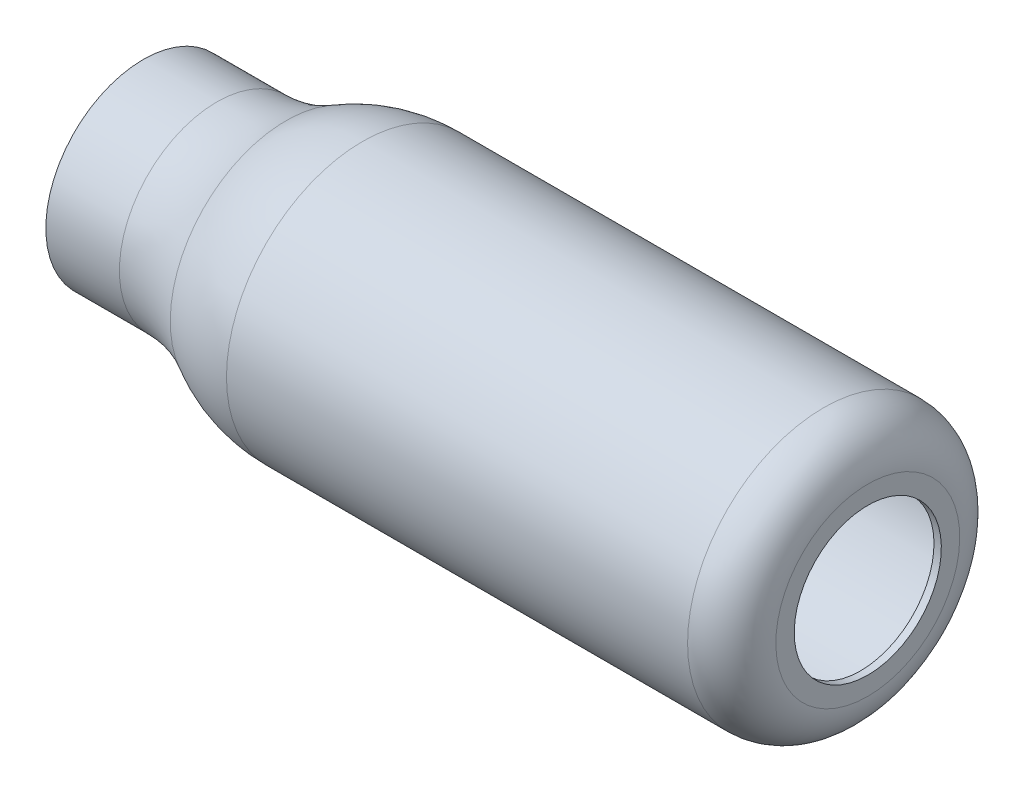
ISO-10303-21;
HEADER;
FILE_DESCRIPTION(('STEP AP214'),'2;1');
FILE_NAME('part.step','',(''),(''),'','','');
FILE_SCHEMA(('AUTOMOTIVE_DESIGN { 1 0 10303 214 1 1 1 1 }'));
ENDSEC;
DATA;
#1=APPLICATION_CONTEXT('core data for automotive mechanical design processes');
#2=APPLICATION_PROTOCOL_DEFINITION('international standard','automotive_design',2000,#1);
#3=PRODUCT_CONTEXT('',#1,'mechanical');
#4=PRODUCT('Part','Part','',(#3));
#5=PRODUCT_RELATED_PRODUCT_CATEGORY('part','',(#4));
#6=PRODUCT_DEFINITION_FORMATION('','',#4);
#7=PRODUCT_DEFINITION_CONTEXT('part definition',#1,'design');
#8=PRODUCT_DEFINITION('design','',#6,#7);
#9=PRODUCT_DEFINITION_SHAPE('','',#8);
#10=(LENGTH_UNIT() NAMED_UNIT(*) SI_UNIT(.MILLI.,.METRE.));
#11=(NAMED_UNIT(*) PLANE_ANGLE_UNIT() SI_UNIT($,.RADIAN.));
#12=(NAMED_UNIT(*) SI_UNIT($,.STERADIAN.) SOLID_ANGLE_UNIT());
#13=UNCERTAINTY_MEASURE_WITH_UNIT(LENGTH_MEASURE(1.E-05),#10,'distance_accuracy_value','');
#14=(GEOMETRIC_REPRESENTATION_CONTEXT(3) GLOBAL_UNCERTAINTY_ASSIGNED_CONTEXT((#13)) GLOBAL_UNIT_ASSIGNED_CONTEXT((#10,
#11,#12)) REPRESENTATION_CONTEXT('',''));
#15=CARTESIAN_POINT('',(0.,0.,0.));
#16=DIRECTION('',(0.,0.,1.));
#17=DIRECTION('',(1.,0.,0.));
#18=AXIS2_PLACEMENT_3D('',#15,#16,#17);
#19=CARTESIAN_POINT('',(37.8587448762851,0.,0.));
#20=DIRECTION('',(-1.,0.,0.));
#21=DIRECTION('',(0.,-1.,0.));
#22=AXIS2_PLACEMENT_3D('',#19,#20,#21);
#23=DEGENERATE_TOROIDAL_SURFACE('',#22,3.175,25.4,.F.);
#24=CARTESIAN_POINT('',(37.8587448762851,0.,0.));
#25=DIRECTION('',(-1.,0.,0.));
#26=DIRECTION('',(0.,-1.,0.));
#27=AXIS2_PLACEMENT_3D('',#24,#25,#26);
#28=CIRCLE('',#27,22.225);
#29=CARTESIAN_POINT('',(37.8587448762851,-22.225,0.));
#30=VERTEX_POINT('',#29);
#31=EDGE_CURVE('E78',#30,#30,#28,.T.);
#32=ORIENTED_EDGE('',*,*,#31,.F.);
#33=EDGE_LOOP('',(#32));
#34=FACE_BOUND('',#33,.T.);
#35=CARTESIAN_POINT('',(25.2793724381425,0.,0.));
#36=DIRECTION('',(-1.,0.,0.));
#37=DIRECTION('',(0.,-1.,0.));
#38=AXIS2_PLACEMENT_3D('',#35,#36,#37);
#39=CIRCLE('',#38,18.89125);
#40=CARTESIAN_POINT('',(25.2793724381425,-18.89125,0.));
#41=VERTEX_POINT('',#40);
#42=EDGE_CURVE('E10',#41,#41,#39,.T.);
#43=ORIENTED_EDGE('',*,*,#42,.T.);
#44=EDGE_LOOP('',(#43));
#45=FACE_BOUND('',#44,.T.);
#46=ADVANCED_FACE('F32',(#34,#45),#23,.T.);
#47=CARTESIAN_POINT('',(12.7,0.,0.));
#48=DIRECTION('',(-1.,0.,0.));
#49=DIRECTION('',(0.,-1.,0.));
#50=AXIS2_PLACEMENT_3D('',#47,#48,#49);
#51=TOROIDAL_SURFACE('',#50,40.9575,25.4);
#52=ORIENTED_EDGE('',*,*,#42,.F.);
#53=EDGE_LOOP('',(#52));
#54=FACE_BOUND('',#53,.T.);
#55=CARTESIAN_POINT('',(12.7,0.,0.));
#56=DIRECTION('',(-1.,0.,0.));
#57=DIRECTION('',(0.,-1.,0.));
#58=AXIS2_PLACEMENT_3D('',#55,#56,#57);
#59=CIRCLE('',#58,15.5575);
#60=CARTESIAN_POINT('',(12.7,-15.5575,0.));
#61=VERTEX_POINT('',#60);
#62=EDGE_CURVE('E38',#61,#61,#59,.T.);
#63=ORIENTED_EDGE('',*,*,#62,.T.);
#64=EDGE_LOOP('',(#63));
#65=FACE_BOUND('',#64,.T.);
#66=ADVANCED_FACE('F85',(#54,#65),#51,.T.);
#67=CARTESIAN_POINT('',(0.,0.,0.));
#68=DIRECTION('',(-1.,0.,0.));
#69=DIRECTION('',(0.,-1.,0.));
#70=AXIS2_PLACEMENT_3D('',#67,#68,#69);
#71=CYLINDRICAL_SURFACE('',#70,15.5575);
#72=ORIENTED_EDGE('',*,*,#62,.F.);
#73=EDGE_LOOP('',(#72));
#74=FACE_BOUND('',#73,.T.);
#75=CARTESIAN_POINT('',(0.,0.,0.));
#76=DIRECTION('',(-1.,0.,0.));
#77=DIRECTION('',(0.,-1.,0.));
#78=AXIS2_PLACEMENT_3D('',#75,#76,#77);
#79=CIRCLE('',#78,15.5575);
#80=CARTESIAN_POINT('',(0.,-15.5575,0.));
#81=VERTEX_POINT('',#80);
#82=EDGE_CURVE('E42',#81,#81,#79,.T.);
#83=ORIENTED_EDGE('',*,*,#82,.T.);
#84=EDGE_LOOP('',(#83));
#85=FACE_BOUND('',#84,.T.);
#86=ADVANCED_FACE('F89',(#74,#85),#71,.F.);
#87=CARTESIAN_POINT('',(0.,16.8275,0.));
#88=DIRECTION('',(1.,0.,0.));
#89=DIRECTION('',(0.,1.,0.));
#90=AXIS2_PLACEMENT_3D('',#87,#88,#89);
#91=PLANE('',#90);
#92=ORIENTED_EDGE('',*,*,#82,.F.);
#93=EDGE_LOOP('',(#92));
#94=FACE_BOUND('',#93,.T.);
#95=CARTESIAN_POINT('',(0.,0.,0.));
#96=DIRECTION('',(-1.,0.,0.));
#97=DIRECTION('',(0.,-1.,0.));
#98=AXIS2_PLACEMENT_3D('',#95,#96,#97);
#99=CIRCLE('',#98,16.8275);
#100=CARTESIAN_POINT('',(0.,-16.8275,0.));
#101=VERTEX_POINT('',#100);
#102=EDGE_CURVE('E46',#101,#101,#99,.T.);
#103=ORIENTED_EDGE('',*,*,#102,.T.);
#104=EDGE_LOOP('',(#103));
#105=FACE_BOUND('',#104,.T.);
#106=ADVANCED_FACE('F94',(#94,#105),#91,.F.);
#107=CARTESIAN_POINT('',(0.,0.,0.));
#108=DIRECTION('',(-1.,0.,0.));
#109=DIRECTION('',(0.,-1.,0.));
#110=AXIS2_PLACEMENT_3D('',#107,#108,#109);
#111=CYLINDRICAL_SURFACE('',#110,16.8275);
#112=ORIENTED_EDGE('',*,*,#102,.F.);
#113=EDGE_LOOP('',(#112));
#114=FACE_BOUND('',#113,.T.);
#115=CARTESIAN_POINT('',(12.7,0.,0.));
#116=DIRECTION('',(-1.,0.,0.));
#117=DIRECTION('',(0.,-1.,0.));
#118=AXIS2_PLACEMENT_3D('',#115,#116,#117);
#119=CIRCLE('',#118,16.8275);
#120=CARTESIAN_POINT('',(12.7,-16.8275,0.));
#121=VERTEX_POINT('',#120);
#122=EDGE_CURVE('E51',#121,#121,#119,.T.);
#123=ORIENTED_EDGE('',*,*,#122,.T.);
#124=EDGE_LOOP('',(#123));
#125=FACE_BOUND('',#124,.T.);
#126=ADVANCED_FACE('F100',(#114,#125),#111,.T.);
#127=CARTESIAN_POINT('',(12.7,0.,0.));
#128=DIRECTION('',(-1.,0.,0.));
#129=DIRECTION('',(0.,-1.,0.));
#130=AXIS2_PLACEMENT_3D('',#127,#128,#129);
#131=TOROIDAL_SURFACE('',#130,40.9575,24.13);
#132=ORIENTED_EDGE('',*,*,#122,.F.);
#133=EDGE_LOOP('',(#132));
#134=FACE_BOUND('',#133,.T.);
#135=CARTESIAN_POINT('',(24.6504038162354,0.,0.));
#136=DIRECTION('',(-1.,0.,0.));
#137=DIRECTION('',(0.,-1.,0.));
#138=AXIS2_PLACEMENT_3D('',#135,#136,#137);
#139=CIRCLE('',#138,19.9945625);
#140=CARTESIAN_POINT('',(24.6504038162354,-19.9945625,0.));
#141=VERTEX_POINT('',#140);
#142=EDGE_CURVE('E54',#141,#141,#139,.T.);
#143=ORIENTED_EDGE('',*,*,#142,.T.);
#144=EDGE_LOOP('',(#143));
#145=FACE_BOUND('',#144,.T.);
#146=ADVANCED_FACE('F104',(#134,#145),#131,.F.);
#147=CARTESIAN_POINT('',(37.8587448762851,0.,0.));
#148=DIRECTION('',(-1.,0.,0.));
#149=DIRECTION('',(0.,-1.,0.));
#150=AXIS2_PLACEMENT_3D('',#147,#148,#149);
#151=DEGENERATE_TOROIDAL_SURFACE('',#150,3.175,26.67,.F.);
#152=ORIENTED_EDGE('',*,*,#142,.F.);
#153=EDGE_LOOP('',(#152));
#154=FACE_BOUND('',#153,.T.);
#155=CARTESIAN_POINT('',(37.8587448762851,0.,0.));
#156=DIRECTION('',(-1.,0.,0.));
#157=DIRECTION('',(0.,-1.,0.));
#158=AXIS2_PLACEMENT_3D('',#155,#156,#157);
#159=CIRCLE('',#158,23.495);
#160=CARTESIAN_POINT('',(37.8587448762851,-23.495,0.));
#161=VERTEX_POINT('',#160);
#162=EDGE_CURVE('E57',#161,#161,#159,.T.);
#163=ORIENTED_EDGE('',*,*,#162,.T.);
#164=EDGE_LOOP('',(#163));
#165=FACE_BOUND('',#164,.T.);
#166=ADVANCED_FACE('F108',(#154,#165),#151,.F.);
#167=CARTESIAN_POINT('',(0.,0.,0.));
#168=DIRECTION('',(-1.,0.,0.));
#169=DIRECTION('',(0.,-1.,0.));
#170=AXIS2_PLACEMENT_3D('',#167,#168,#169);
#171=CYLINDRICAL_SURFACE('',#170,23.495);
#172=ORIENTED_EDGE('',*,*,#162,.F.);
#173=EDGE_LOOP('',(#172));
#174=FACE_BOUND('',#173,.T.);
#175=CARTESIAN_POINT('',(117.475,0.,0.));
#176=DIRECTION('',(-1.,0.,0.));
#177=DIRECTION('',(0.,-1.,0.));
#178=AXIS2_PLACEMENT_3D('',#175,#176,#177);
#179=CIRCLE('',#178,23.495);
#180=CARTESIAN_POINT('',(117.475,-23.495,0.));
#181=VERTEX_POINT('',#180);
#182=EDGE_CURVE('E60',#181,#181,#179,.T.);
#183=ORIENTED_EDGE('',*,*,#182,.T.);
#184=EDGE_LOOP('',(#183));
#185=FACE_BOUND('',#184,.T.);
#186=ADVANCED_FACE('F112',(#174,#185),#171,.T.);
#187=CARTESIAN_POINT('',(117.475,0.,0.));
#188=DIRECTION('',(-1.,0.,0.));
#189=DIRECTION('',(0.,-1.,0.));
#190=AXIS2_PLACEMENT_3D('',#187,#188,#189);
#191=TOROIDAL_SURFACE('',#190,15.875,7.61999999999999);
#192=ORIENTED_EDGE('',*,*,#182,.F.);
#193=EDGE_LOOP('',(#192));
#194=FACE_BOUND('',#193,.T.);
#195=CARTESIAN_POINT('',(125.095,0.,0.));
#196=DIRECTION('',(-1.,0.,0.));
#197=DIRECTION('',(0.,-1.,0.));
#198=AXIS2_PLACEMENT_3D('',#195,#196,#197);
#199=CIRCLE('',#198,15.875);
#200=CARTESIAN_POINT('',(125.095,-15.875,0.));
#201=VERTEX_POINT('',#200);
#202=EDGE_CURVE('E63',#201,#201,#199,.T.);
#203=ORIENTED_EDGE('',*,*,#202,.T.);
#204=EDGE_LOOP('',(#203));
#205=FACE_BOUND('',#204,.T.);
#206=ADVANCED_FACE('F116',(#194,#205),#191,.T.);
#207=CARTESIAN_POINT('',(125.095,15.875,0.));
#208=DIRECTION('',(-1.,0.,0.));
#209=DIRECTION('',(0.,-1.,0.));
#210=AXIS2_PLACEMENT_3D('',#207,#208,#209);
#211=PLANE('',#210);
#212=ORIENTED_EDGE('',*,*,#202,.F.);
#213=EDGE_LOOP('',(#212));
#214=FACE_BOUND('',#213,.T.);
#215=CARTESIAN_POINT('',(125.095,0.,0.));
#216=DIRECTION('',(-1.,0.,0.));
#217=DIRECTION('',(0.,-1.,0.));
#218=AXIS2_PLACEMENT_3D('',#215,#216,#217);
#219=CIRCLE('',#218,12.7);
#220=CARTESIAN_POINT('',(125.095,-12.7,0.));
#221=VERTEX_POINT('',#220);
#222=EDGE_CURVE('E66',#221,#221,#219,.T.);
#223=ORIENTED_EDGE('',*,*,#222,.T.);
#224=EDGE_LOOP('',(#223));
#225=FACE_BOUND('',#224,.T.);
#226=ADVANCED_FACE('F120',(#214,#225),#211,.F.);
#227=CARTESIAN_POINT('',(0.,0.,0.));
#228=DIRECTION('',(-1.,0.,0.));
#229=DIRECTION('',(0.,-1.,0.));
#230=AXIS2_PLACEMENT_3D('',#227,#228,#229);
#231=CYLINDRICAL_SURFACE('',#230,12.7);
#232=ORIENTED_EDGE('',*,*,#222,.F.);
#233=EDGE_LOOP('',(#232));
#234=FACE_BOUND('',#233,.T.);
#235=CARTESIAN_POINT('',(123.825,0.,0.));
#236=DIRECTION('',(-1.,0.,0.));
#237=DIRECTION('',(0.,-1.,0.));
#238=AXIS2_PLACEMENT_3D('',#235,#236,#237);
#239=CIRCLE('',#238,12.7);
#240=CARTESIAN_POINT('',(123.825,-12.7,0.));
#241=VERTEX_POINT('',#240);
#242=EDGE_CURVE('E69',#241,#241,#239,.T.);
#243=ORIENTED_EDGE('',*,*,#242,.T.);
#244=EDGE_LOOP('',(#243));
#245=FACE_BOUND('',#244,.T.);
#246=ADVANCED_FACE('F124',(#234,#245),#231,.F.);
#247=CARTESIAN_POINT('',(123.825,15.875,0.));
#248=DIRECTION('',(1.,0.,0.));
#249=DIRECTION('',(0.,1.,0.));
#250=AXIS2_PLACEMENT_3D('',#247,#248,#249);
#251=PLANE('',#250);
#252=ORIENTED_EDGE('',*,*,#242,.F.);
#253=EDGE_LOOP('',(#252));
#254=FACE_BOUND('',#253,.T.);
#255=CARTESIAN_POINT('',(123.825,0.,0.));
#256=DIRECTION('',(-1.,0.,0.));
#257=DIRECTION('',(0.,-1.,0.));
#258=AXIS2_PLACEMENT_3D('',#255,#256,#257);
#259=CIRCLE('',#258,15.875);
#260=CARTESIAN_POINT('',(123.825,-15.875,0.));
#261=VERTEX_POINT('',#260);
#262=EDGE_CURVE('E72',#261,#261,#259,.T.);
#263=ORIENTED_EDGE('',*,*,#262,.T.);
#264=EDGE_LOOP('',(#263));
#265=FACE_BOUND('',#264,.T.);
#266=ADVANCED_FACE('F128',(#254,#265),#251,.F.);
#267=CARTESIAN_POINT('',(117.475,0.,0.));
#268=DIRECTION('',(-1.,0.,0.));
#269=DIRECTION('',(0.,-1.,0.));
#270=AXIS2_PLACEMENT_3D('',#267,#268,#269);
#271=TOROIDAL_SURFACE('',#270,15.875,6.34999999999999);
#272=ORIENTED_EDGE('',*,*,#262,.F.);
#273=EDGE_LOOP('',(#272));
#274=FACE_BOUND('',#273,.T.);
#275=CARTESIAN_POINT('',(117.475,0.,0.));
#276=DIRECTION('',(-1.,0.,0.));
#277=DIRECTION('',(0.,-1.,0.));
#278=AXIS2_PLACEMENT_3D('',#275,#276,#277);
#279=CIRCLE('',#278,22.225);
#280=CARTESIAN_POINT('',(117.475,-22.225,0.));
#281=VERTEX_POINT('',#280);
#282=EDGE_CURVE('E75',#281,#281,#279,.T.);
#283=ORIENTED_EDGE('',*,*,#282,.T.);
#284=EDGE_LOOP('',(#283));
#285=FACE_BOUND('',#284,.T.);
#286=ADVANCED_FACE('F132',(#274,#285),#271,.F.);
#287=CARTESIAN_POINT('',(0.,0.,0.));
#288=DIRECTION('',(-1.,0.,0.));
#289=DIRECTION('',(0.,-1.,0.));
#290=AXIS2_PLACEMENT_3D('',#287,#288,#289);
#291=CYLINDRICAL_SURFACE('',#290,22.225);
#292=ORIENTED_EDGE('',*,*,#282,.F.);
#293=EDGE_LOOP('',(#292));
#294=FACE_BOUND('',#293,.T.);
#295=ORIENTED_EDGE('',*,*,#31,.T.);
#296=EDGE_LOOP('',(#295));
#297=FACE_BOUND('',#296,.T.);
#298=ADVANCED_FACE('F82',(#294,#297),#291,.F.);
#299=CLOSED_SHELL('',(#46,#66,#86,#106,#126,#146,#166,#186,#206,#226,#246,#266,#286,#298));
#300=MANIFOLD_SOLID_BREP('B2',#299);
#301=ADVANCED_BREP_SHAPE_REPRESENTATION('',(#18,#300),#14);
#302=SHAPE_DEFINITION_REPRESENTATION(#9,#301);
ENDSEC;
END-ISO-10303-21;
